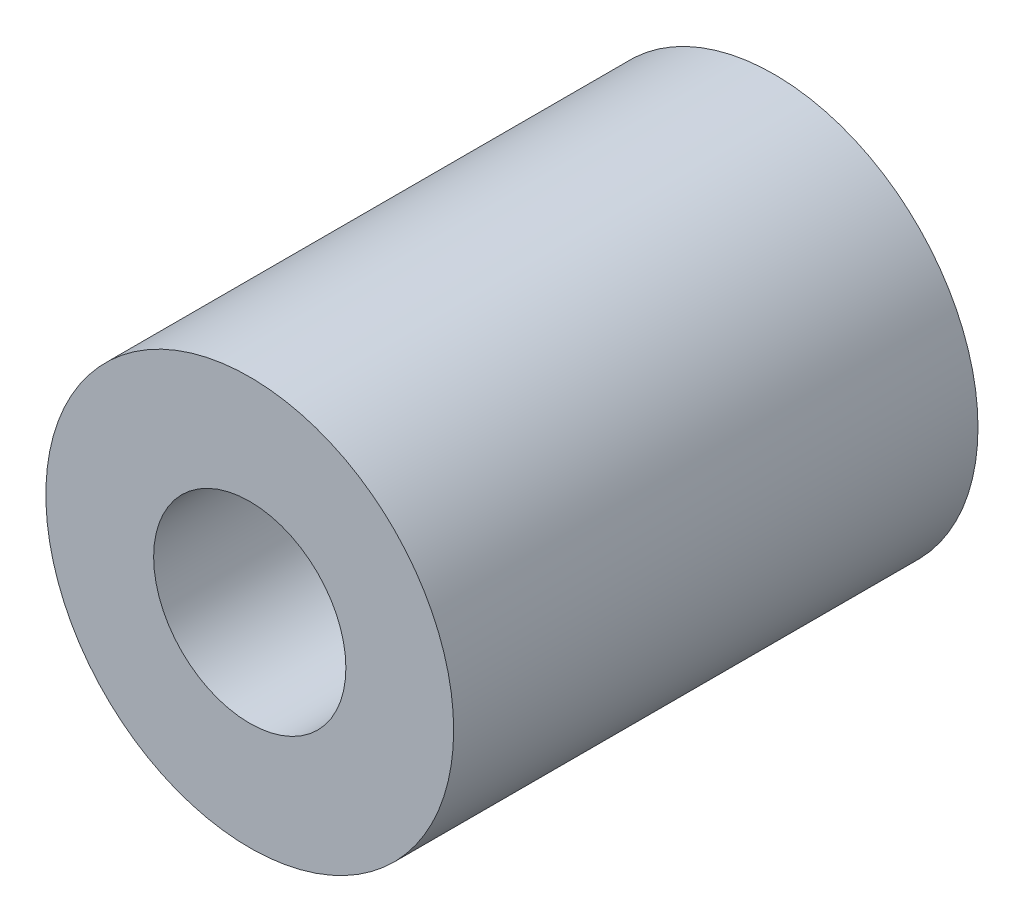
ISO-10303-21;
HEADER;
FILE_DESCRIPTION(('STEP AP214'),'2;1');
FILE_NAME('part.step','',(''),(''),'','','');
FILE_SCHEMA(('AUTOMOTIVE_DESIGN { 1 0 10303 214 1 1 1 1 }'));
ENDSEC;
DATA;
#1=APPLICATION_CONTEXT('core data for automotive mechanical design processes');
#2=APPLICATION_PROTOCOL_DEFINITION('international standard','automotive_design',2000,#1);
#3=PRODUCT_CONTEXT('',#1,'mechanical');
#4=PRODUCT('Part','Part','',(#3));
#5=PRODUCT_RELATED_PRODUCT_CATEGORY('part','',(#4));
#6=PRODUCT_DEFINITION_FORMATION('','',#4);
#7=PRODUCT_DEFINITION_CONTEXT('part definition',#1,'design');
#8=PRODUCT_DEFINITION('design','',#6,#7);
#9=PRODUCT_DEFINITION_SHAPE('','',#8);
#10=(LENGTH_UNIT() NAMED_UNIT(*) SI_UNIT(.MILLI.,.METRE.));
#11=(NAMED_UNIT(*) PLANE_ANGLE_UNIT() SI_UNIT($,.RADIAN.));
#12=(NAMED_UNIT(*) SI_UNIT($,.STERADIAN.) SOLID_ANGLE_UNIT());
#13=UNCERTAINTY_MEASURE_WITH_UNIT(LENGTH_MEASURE(1.E-05),#10,'distance_accuracy_value','');
#14=(GEOMETRIC_REPRESENTATION_CONTEXT(3) GLOBAL_UNCERTAINTY_ASSIGNED_CONTEXT((#13)) GLOBAL_UNIT_ASSIGNED_CONTEXT((#10,
#11,#12)) REPRESENTATION_CONTEXT('',''));
#15=CARTESIAN_POINT('',(0.,0.,0.));
#16=DIRECTION('',(0.,0.,1.));
#17=DIRECTION('',(1.,0.,0.));
#18=AXIS2_PLACEMENT_3D('',#15,#16,#17);
#19=CARTESIAN_POINT('',(0.,0.,9.));
#20=DIRECTION('',(0.,0.,-1.));
#21=DIRECTION('',(-1.,0.,0.));
#22=AXIS2_PLACEMENT_3D('',#19,#20,#21);
#23=CYLINDRICAL_SURFACE('',#22,3.5);
#24=CARTESIAN_POINT('',(0.,0.,9.));
#25=DIRECTION('',(0.,0.,1.));
#26=DIRECTION('',(1.,0.,0.));
#27=AXIS2_PLACEMENT_3D('',#24,#25,#26);
#28=CIRCLE('',#27,3.5);
#29=CARTESIAN_POINT('',(3.5,0.,9.));
#30=VERTEX_POINT('',#29);
#31=EDGE_CURVE('E10',#30,#30,#28,.T.);
#32=ORIENTED_EDGE('',*,*,#31,.F.);
#33=EDGE_LOOP('',(#32));
#34=FACE_BOUND('',#33,.T.);
#35=CARTESIAN_POINT('',(0.,0.,0.));
#36=DIRECTION('',(0.,0.,1.));
#37=DIRECTION('',(1.,0.,0.));
#38=AXIS2_PLACEMENT_3D('',#35,#36,#37);
#39=CIRCLE('',#38,3.5);
#40=CARTESIAN_POINT('',(3.5,0.,0.));
#41=VERTEX_POINT('',#40);
#42=EDGE_CURVE('E38',#41,#41,#39,.T.);
#43=ORIENTED_EDGE('',*,*,#42,.T.);
#44=EDGE_LOOP('',(#43));
#45=FACE_BOUND('',#44,.T.);
#46=ADVANCED_FACE('F35',(#34,#45),#23,.T.);
#47=CARTESIAN_POINT('',(0.,0.,9.));
#48=DIRECTION('',(0.,0.,1.));
#49=DIRECTION('',(1.,0.,0.));
#50=AXIS2_PLACEMENT_3D('',#47,#48,#49);
#51=PLANE('',#50);
#52=CARTESIAN_POINT('',(0.,0.,9.));
#53=DIRECTION('',(0.,0.,1.));
#54=DIRECTION('',(1.,0.,0.));
#55=AXIS2_PLACEMENT_3D('',#52,#53,#54);
#56=CIRCLE('',#55,1.65);
#57=CARTESIAN_POINT('',(1.65,0.,9.));
#58=VERTEX_POINT('',#57);
#59=EDGE_CURVE('E49',#58,#58,#56,.T.);
#60=ORIENTED_EDGE('',*,*,#59,.F.);
#61=EDGE_LOOP('',(#60));
#62=FACE_BOUND('',#61,.T.);
#63=ORIENTED_EDGE('',*,*,#31,.T.);
#64=EDGE_LOOP('',(#63));
#65=FACE_BOUND('',#64,.T.);
#66=ADVANCED_FACE('F55',(#62,#65),#51,.T.);
#67=CARTESIAN_POINT('',(0.,0.,0.));
#68=DIRECTION('',(0.,0.,1.));
#69=DIRECTION('',(1.,0.,0.));
#70=AXIS2_PLACEMENT_3D('',#67,#68,#69);
#71=PLANE('',#70);
#72=CARTESIAN_POINT('',(0.,0.,0.));
#73=DIRECTION('',(0.,0.,1.));
#74=DIRECTION('',(1.,0.,0.));
#75=AXIS2_PLACEMENT_3D('',#72,#73,#74);
#76=CIRCLE('',#75,1.65);
#77=CARTESIAN_POINT('',(1.65,0.,0.));
#78=VERTEX_POINT('',#77);
#79=EDGE_CURVE('E45',#78,#78,#76,.T.);
#80=ORIENTED_EDGE('',*,*,#79,.T.);
#81=EDGE_LOOP('',(#80));
#82=FACE_BOUND('',#81,.T.);
#83=ORIENTED_EDGE('',*,*,#42,.F.);
#84=EDGE_LOOP('',(#83));
#85=FACE_BOUND('',#84,.T.);
#86=ADVANCED_FACE('F57',(#82,#85),#71,.F.);
#87=CARTESIAN_POINT('',(0.,0.,9.));
#88=DIRECTION('',(0.,0.,1.));
#89=DIRECTION('',(1.,0.,0.));
#90=AXIS2_PLACEMENT_3D('',#87,#88,#89);
#91=CYLINDRICAL_SURFACE('',#90,1.65);
#92=ORIENTED_EDGE('',*,*,#79,.F.);
#93=EDGE_LOOP('',(#92));
#94=FACE_BOUND('',#93,.T.);
#95=ORIENTED_EDGE('',*,*,#59,.T.);
#96=EDGE_LOOP('',(#95));
#97=FACE_BOUND('',#96,.T.);
#98=ADVANCED_FACE('F53',(#94,#97),#91,.F.);
#99=CLOSED_SHELL('',(#46,#66,#86,#98));
#100=MANIFOLD_SOLID_BREP('B2',#99);
#101=ADVANCED_BREP_SHAPE_REPRESENTATION('',(#18,#100),#14);
#102=SHAPE_DEFINITION_REPRESENTATION(#9,#101);
ENDSEC;
END-ISO-10303-21;
